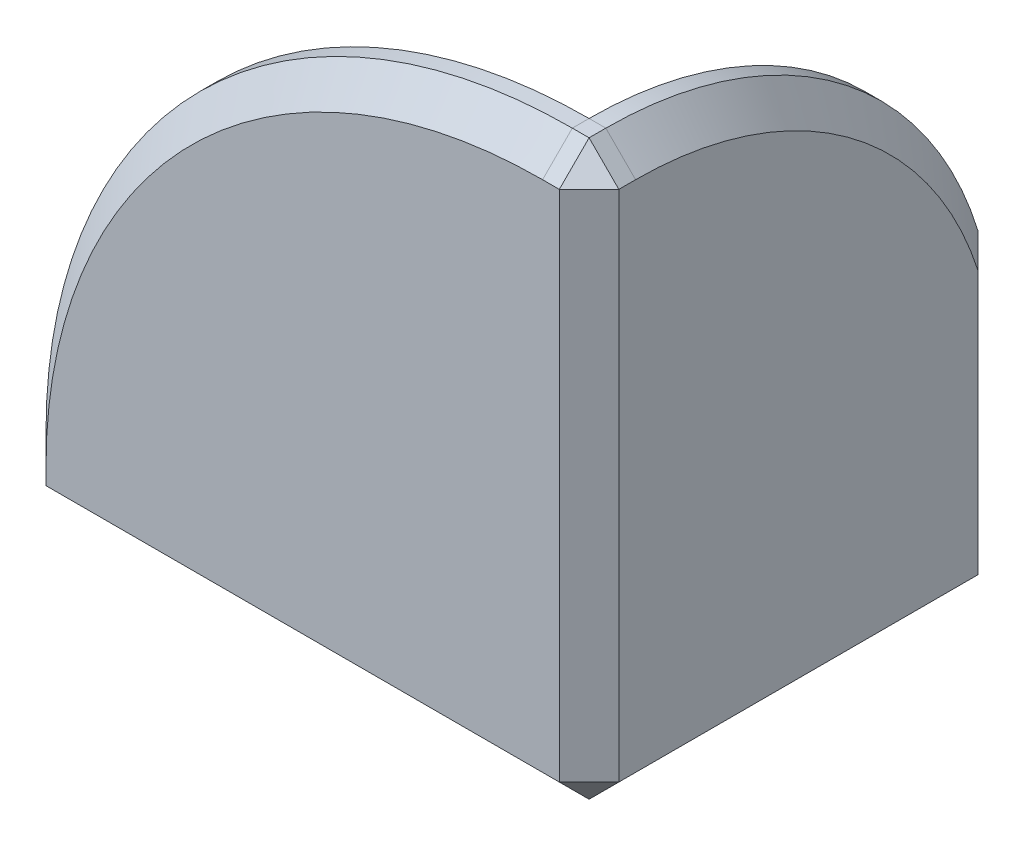
ISO-10303-21;
HEADER;
FILE_DESCRIPTION(('STEP AP214'),'2;1');
FILE_NAME('part.step','',(''),(''),'','','');
FILE_SCHEMA(('AUTOMOTIVE_DESIGN { 1 0 10303 214 1 1 1 1 }'));
ENDSEC;
DATA;
#1=APPLICATION_CONTEXT('core data for automotive mechanical design processes');
#2=APPLICATION_PROTOCOL_DEFINITION('international standard','automotive_design',2000,#1);
#3=PRODUCT_CONTEXT('',#1,'mechanical');
#4=PRODUCT('Part','Part','',(#3));
#5=PRODUCT_RELATED_PRODUCT_CATEGORY('part','',(#4));
#6=PRODUCT_DEFINITION_FORMATION('','',#4);
#7=PRODUCT_DEFINITION_CONTEXT('part definition',#1,'design');
#8=PRODUCT_DEFINITION('design','',#6,#7);
#9=PRODUCT_DEFINITION_SHAPE('','',#8);
#10=(LENGTH_UNIT() NAMED_UNIT(*) SI_UNIT(.MILLI.,.METRE.));
#11=(NAMED_UNIT(*) PLANE_ANGLE_UNIT() SI_UNIT($,.RADIAN.));
#12=(NAMED_UNIT(*) SI_UNIT($,.STERADIAN.) SOLID_ANGLE_UNIT());
#13=UNCERTAINTY_MEASURE_WITH_UNIT(LENGTH_MEASURE(1.E-05),#10,'distance_accuracy_value','');
#14=(GEOMETRIC_REPRESENTATION_CONTEXT(3) GLOBAL_UNCERTAINTY_ASSIGNED_CONTEXT((#13)) GLOBAL_UNIT_ASSIGNED_CONTEXT((#10,
#11,#12)) REPRESENTATION_CONTEXT('',''));
#15=CARTESIAN_POINT('',(0.,0.,0.));
#16=DIRECTION('',(0.,0.,1.));
#17=DIRECTION('',(1.,0.,0.));
#18=AXIS2_PLACEMENT_3D('',#15,#16,#17);
#19=CARTESIAN_POINT('',(0.,0.,3.175));
#20=DIRECTION('',(0.,0.,-1.));
#21=DIRECTION('',(-1.,0.,0.));
#22=AXIS2_PLACEMENT_3D('',#19,#20,#21);
#23=CYLINDRICAL_SURFACE('',#22,35.9210244842766);
#24=DIRECTION('',(0.,0.,-1.));
#25=VECTOR('',#24,1.);
#26=CARTESIAN_POINT('',(-35.9210244842766,0.,3.175));
#27=LINE('',#26,#25);
#28=CARTESIAN_POINT('',(-35.9210244842766,0.,1.14299999999998));
#29=VERTEX_POINT('',#28);
#30=CARTESIAN_POINT('',(-35.9210244842766,0.,0.));
#31=VERTEX_POINT('',#30);
#32=EDGE_CURVE('E182',#29,#31,#27,.T.);
#33=ORIENTED_EDGE('',*,*,#32,.F.);
#34=CARTESIAN_POINT('',(0.,0.,1.14299999999998));
#35=DIRECTION('',(0.,0.,1.));
#36=DIRECTION('',(1.,0.,0.));
#37=AXIS2_PLACEMENT_3D('',#34,#35,#36);
#38=CIRCLE('',#37,35.9210244842766);
#39=CARTESIAN_POINT('',(0.,35.9210244842766,1.14299999999998));
#40=VERTEX_POINT('',#39);
#41=EDGE_CURVE('E11',#29,#40,#38,.F.);
#42=ORIENTED_EDGE('',*,*,#41,.T.);
#43=DIRECTION('',(0.,0.,-1.));
#44=VECTOR('',#43,1.);
#45=CARTESIAN_POINT('',(0.,35.9210244842766,3.175));
#46=LINE('',#45,#44);
#47=CARTESIAN_POINT('',(0.,35.9210244842766,0.));
#48=VERTEX_POINT('',#47);
#49=EDGE_CURVE('E185',#40,#48,#46,.T.);
#50=ORIENTED_EDGE('',*,*,#49,.T.);
#51=CARTESIAN_POINT('',(0.,0.,0.));
#52=DIRECTION('',(0.,0.,1.));
#53=DIRECTION('',(1.,0.,0.));
#54=AXIS2_PLACEMENT_3D('',#51,#52,#53);
#55=CIRCLE('',#54,35.9210244842766);
#56=EDGE_CURVE('E180',#48,#31,#55,.T.);
#57=ORIENTED_EDGE('',*,*,#56,.T.);
#58=EDGE_LOOP('',(#33,#42,#50,#57));
#59=FACE_BOUND('',#58,.T.);
#60=ADVANCED_FACE('F33',(#59),#23,.T.);
#61=CARTESIAN_POINT('',(0.,0.,3.175));
#62=DIRECTION('',(0.,0.,1.));
#63=DIRECTION('',(1.,0.,0.));
#64=AXIS2_PLACEMENT_3D('',#61,#62,#63);
#65=PLANE('',#64);
#66=DIRECTION('',(0.,1.,0.));
#67=VECTOR('',#66,1.);
#68=CARTESIAN_POINT('',(1.14299999999999,35.9210244842766,3.175));
#69=LINE('',#68,#67);
#70=CARTESIAN_POINT('',(1.14299999999999,-1.14299999999999,3.175));
#71=VERTEX_POINT('',#70);
#72=CARTESIAN_POINT('',(1.14299999999999,33.8890244842766,3.175));
#73=VERTEX_POINT('',#72);
#74=EDGE_CURVE('E50',#71,#73,#69,.T.);
#75=ORIENTED_EDGE('',*,*,#74,.T.);
#76=DIRECTION('',(-1.,0.,0.));
#77=VECTOR('',#76,1.);
#78=CARTESIAN_POINT('',(0.,33.8890244842766,3.175));
#79=LINE('',#78,#77);
#80=CARTESIAN_POINT('',(0.,33.8890244842766,3.175));
#81=VERTEX_POINT('',#80);
#82=EDGE_CURVE('E42',#73,#81,#79,.T.);
#83=ORIENTED_EDGE('',*,*,#82,.T.);
#84=CARTESIAN_POINT('',(0.,0.,3.175));
#85=DIRECTION('',(0.,0.,1.));
#86=DIRECTION('',(1.,0.,0.));
#87=AXIS2_PLACEMENT_3D('',#84,#85,#86);
#88=CIRCLE('',#87,33.8890244842766);
#89=CARTESIAN_POINT('',(-33.8890244842766,0.,3.175));
#90=VERTEX_POINT('',#89);
#91=EDGE_CURVE('E236',#81,#90,#88,.T.);
#92=ORIENTED_EDGE('',*,*,#91,.T.);
#93=DIRECTION('',(0.,-1.,0.));
#94=VECTOR('',#93,1.);
#95=CARTESIAN_POINT('',(-33.8890244842766,-3.175,3.175));
#96=LINE('',#95,#94);
#97=CARTESIAN_POINT('',(-33.8890244842766,-1.14299999999999,3.175));
#98=VERTEX_POINT('',#97);
#99=EDGE_CURVE('E238',#90,#98,#96,.T.);
#100=ORIENTED_EDGE('',*,*,#99,.T.);
#101=DIRECTION('',(1.,0.,0.));
#102=VECTOR('',#101,1.);
#103=CARTESIAN_POINT('',(0.,-1.14299999999999,3.175));
#104=LINE('',#103,#102);
#105=EDGE_CURVE('E55',#98,#71,#104,.T.);
#106=ORIENTED_EDGE('',*,*,#105,.T.);
#107=EDGE_LOOP('',(#75,#83,#92,#100,#106));
#108=FACE_BOUND('',#107,.T.);
#109=ADVANCED_FACE('F359',(#108),#65,.T.);
#110=CARTESIAN_POINT('',(0.,0.,0.));
#111=DIRECTION('',(0.,0.,1.));
#112=DIRECTION('',(1.,0.,0.));
#113=AXIS2_PLACEMENT_3D('',#110,#111,#112);
#114=PLANE('',#113);
#115=DIRECTION('',(1.,0.,0.));
#116=VECTOR('',#115,1.);
#117=CARTESIAN_POINT('',(0.,0.,0.));
#118=LINE('',#117,#116);
#119=CARTESIAN_POINT('',(0.,0.,0.));
#120=VERTEX_POINT('',#119);
#121=EDGE_CURVE('E191',#31,#120,#118,.T.);
#122=ORIENTED_EDGE('',*,*,#121,.F.);
#123=ORIENTED_EDGE('',*,*,#56,.F.);
#124=DIRECTION('',(0.,1.,0.));
#125=VECTOR('',#124,1.);
#126=CARTESIAN_POINT('',(0.,0.,0.));
#127=LINE('',#126,#125);
#128=EDGE_CURVE('E183',#120,#48,#127,.T.);
#129=ORIENTED_EDGE('',*,*,#128,.F.);
#130=EDGE_LOOP('',(#122,#123,#129));
#131=FACE_BOUND('',#130,.T.);
#132=ADVANCED_FACE('F345',(#131),#114,.F.);
#133=CARTESIAN_POINT('',(3.175,0.,-25.4));
#134=DIRECTION('',(0.,0.,1.));
#135=DIRECTION('',(1.,0.,0.));
#136=AXIS2_PLACEMENT_3D('',#133,#134,#135);
#137=PLANE('',#136);
#138=DIRECTION('',(0.,-1.,0.));
#139=VECTOR('',#138,1.);
#140=CARTESIAN_POINT('',(1.14299999999998,0.,-25.4));
#141=LINE('',#140,#139);
#142=CARTESIAN_POINT('',(1.14299999999998,17.145,-25.4));
#143=VERTEX_POINT('',#142);
#144=CARTESIAN_POINT('',(1.14299999999998,-1.14299999999998,-25.4));
#145=VERTEX_POINT('',#144);
#146=EDGE_CURVE('E216',#143,#145,#141,.T.);
#147=ORIENTED_EDGE('',*,*,#146,.T.);
#148=DIRECTION('',(-1.,0.,0.));
#149=VECTOR('',#148,1.);
#150=CARTESIAN_POINT('',(-17.145,-1.14299999999998,-25.4));
#151=LINE('',#150,#149);
#152=CARTESIAN_POINT('',(-17.145,-1.14299999999998,-25.4));
#153=VERTEX_POINT('',#152);
#154=EDGE_CURVE('E147',#145,#153,#151,.T.);
#155=ORIENTED_EDGE('',*,*,#154,.T.);
#156=DIRECTION('',(0.,1.,0.));
#157=VECTOR('',#156,1.);
#158=CARTESIAN_POINT('',(-17.145,-3.175,-25.4));
#159=LINE('',#158,#157);
#160=CARTESIAN_POINT('',(-17.145,0.,-25.4));
#161=VERTEX_POINT('',#160);
#162=EDGE_CURVE('E140',#153,#161,#159,.T.);
#163=ORIENTED_EDGE('',*,*,#162,.T.);
#164=DIRECTION('',(1.,0.,0.));
#165=VECTOR('',#164,1.);
#166=CARTESIAN_POINT('',(0.,0.,-25.4));
#167=LINE('',#166,#165);
#168=CARTESIAN_POINT('',(0.,0.,-25.4));
#169=VERTEX_POINT('',#168);
#170=EDGE_CURVE('E145',#161,#169,#167,.T.);
#171=ORIENTED_EDGE('',*,*,#170,.T.);
#172=DIRECTION('',(0.,1.,0.));
#173=VECTOR('',#172,1.);
#174=CARTESIAN_POINT('',(0.,0.,-25.4));
#175=LINE('',#174,#173);
#176=CARTESIAN_POINT('',(0.,17.145,-25.4));
#177=VERTEX_POINT('',#176);
#178=EDGE_CURVE('E178',#169,#177,#175,.T.);
#179=ORIENTED_EDGE('',*,*,#178,.T.);
#180=DIRECTION('',(-1.,0.,0.));
#181=VECTOR('',#180,1.);
#182=CARTESIAN_POINT('',(3.175,17.145,-25.4));
#183=LINE('',#182,#181);
#184=EDGE_CURVE('E179',#143,#177,#183,.T.);
#185=ORIENTED_EDGE('',*,*,#184,.F.);
#186=EDGE_LOOP('',(#147,#155,#163,#171,#179,#185));
#187=FACE_BOUND('',#186,.T.);
#188=ADVANCED_FACE('F142',(#187),#137,.F.);
#189=CARTESIAN_POINT('',(3.175,9.35259152687271,0.));
#190=DIRECTION('',(-1.,0.,0.));
#191=DIRECTION('',(0.,0.,1.));
#192=AXIS2_PLACEMENT_3D('',#189,#190,#191);
#193=CYLINDRICAL_SURFACE('',#192,26.5684329574039);
#194=DIRECTION('',(-1.,0.,0.));
#195=VECTOR('',#194,1.);
#196=CARTESIAN_POINT('',(3.175,35.9210244842766,0.));
#197=LINE('',#196,#195);
#198=CARTESIAN_POINT('',(1.14299999999998,35.9210244842766,0.));
#199=VERTEX_POINT('',#198);
#200=EDGE_CURVE('E333',#199,#48,#197,.T.);
#201=ORIENTED_EDGE('',*,*,#200,.F.);
#202=CARTESIAN_POINT('',(1.14299999999998,9.35259152687271,0.));
#203=DIRECTION('',(-1.,0.,0.));
#204=DIRECTION('',(0.,0.,1.));
#205=AXIS2_PLACEMENT_3D('',#202,#203,#204);
#206=CIRCLE('',#205,26.5684329574039);
#207=EDGE_CURVE('E234',#199,#143,#206,.T.);
#208=ORIENTED_EDGE('',*,*,#207,.T.);
#209=ORIENTED_EDGE('',*,*,#184,.T.);
#210=CARTESIAN_POINT('',(0.,9.35259152687271,0.));
#211=DIRECTION('',(1.,0.,0.));
#212=DIRECTION('',(0.,0.,1.));
#213=AXIS2_PLACEMENT_3D('',#210,#211,#212);
#214=CIRCLE('',#213,26.5684329574039);
#215=EDGE_CURVE('E173',#177,#48,#214,.T.);
#216=ORIENTED_EDGE('',*,*,#215,.T.);
#217=EDGE_LOOP('',(#201,#208,#209,#216));
#218=FACE_BOUND('',#217,.T.);
#219=ADVANCED_FACE('F336',(#218),#193,.T.);
#220=CARTESIAN_POINT('',(3.175,35.9210244842766,0.));
#221=DIRECTION('',(0.,-1.,0.));
#222=DIRECTION('',(0.,0.,-1.));
#223=AXIS2_PLACEMENT_3D('',#220,#221,#222);
#224=PLANE('',#223);
#225=DIRECTION('',(1.,0.,0.));
#226=VECTOR('',#225,1.);
#227=CARTESIAN_POINT('',(3.175,35.9210244842766,1.14299999999998));
#228=LINE('',#227,#226);
#229=CARTESIAN_POINT('',(1.14299999999998,35.9210244842766,1.14299999999998));
#230=VERTEX_POINT('',#229);
#231=EDGE_CURVE('E230',#40,#230,#228,.T.);
#232=ORIENTED_EDGE('',*,*,#231,.T.);
#233=DIRECTION('',(0.,0.,-1.));
#234=VECTOR('',#233,1.);
#235=CARTESIAN_POINT('',(1.14299999999998,35.9210244842766,0.));
#236=LINE('',#235,#234);
#237=EDGE_CURVE('E232',#230,#199,#236,.T.);
#238=ORIENTED_EDGE('',*,*,#237,.T.);
#239=ORIENTED_EDGE('',*,*,#200,.T.);
#240=ORIENTED_EDGE('',*,*,#49,.F.);
#241=EDGE_LOOP('',(#232,#238,#239,#240));
#242=FACE_BOUND('',#241,.T.);
#243=ADVANCED_FACE('F331',(#242),#224,.F.);
#244=CARTESIAN_POINT('',(3.175,9.35259152687271,0.));
#245=DIRECTION('',(-1.,0.,0.));
#246=DIRECTION('',(0.,0.,1.));
#247=AXIS2_PLACEMENT_3D('',#244,#245,#246);
#248=PLANE('',#247);
#249=CARTESIAN_POINT('',(3.175,9.35259152687271,0.));
#250=DIRECTION('',(-1.,0.,0.));
#251=DIRECTION('',(0.,0.,1.));
#252=AXIS2_PLACEMENT_3D('',#249,#250,#251);
#253=CIRCLE('',#252,24.5364329574039);
#254=CARTESIAN_POINT('',(3.175,16.8341099738981,-23.368));
#255=VERTEX_POINT('',#254);
#256=CARTESIAN_POINT('',(3.175,33.8890244842766,0.));
#257=VERTEX_POINT('',#256);
#258=EDGE_CURVE('E225',#255,#257,#253,.F.);
#259=ORIENTED_EDGE('',*,*,#258,.T.);
#260=DIRECTION('',(0.,0.,1.));
#261=VECTOR('',#260,1.);
#262=CARTESIAN_POINT('',(3.175,33.8890244842766,0.));
#263=LINE('',#262,#261);
#264=CARTESIAN_POINT('',(3.175,33.8890244842766,1.14299999999998));
#265=VERTEX_POINT('',#264);
#266=EDGE_CURVE('E227',#257,#265,#263,.T.);
#267=ORIENTED_EDGE('',*,*,#266,.T.);
#268=DIRECTION('',(0.,-1.,0.));
#269=VECTOR('',#268,1.);
#270=CARTESIAN_POINT('',(3.175,-3.175,1.14299999999998));
#271=LINE('',#270,#269);
#272=CARTESIAN_POINT('',(3.175,-1.14299999999998,1.14299999999998));
#273=VERTEX_POINT('',#272);
#274=EDGE_CURVE('E219',#265,#273,#271,.T.);
#275=ORIENTED_EDGE('',*,*,#274,.T.);
#276=DIRECTION('',(0.,0.,-1.));
#277=VECTOR('',#276,1.);
#278=CARTESIAN_POINT('',(3.175,-1.14299999999998,-25.4));
#279=LINE('',#278,#277);
#280=CARTESIAN_POINT('',(3.175,-1.14299999999998,-23.368));
#281=VERTEX_POINT('',#280);
#282=EDGE_CURVE('E221',#273,#281,#279,.T.);
#283=ORIENTED_EDGE('',*,*,#282,.T.);
#284=DIRECTION('',(0.,1.,0.));
#285=VECTOR('',#284,1.);
#286=CARTESIAN_POINT('',(3.175,9.35259152687271,-23.368));
#287=LINE('',#286,#285);
#288=EDGE_CURVE('E223',#281,#255,#287,.T.);
#289=ORIENTED_EDGE('',*,*,#288,.T.);
#290=EDGE_LOOP('',(#259,#267,#275,#283,#289));
#291=FACE_BOUND('',#290,.T.);
#292=ADVANCED_FACE('F374',(#291),#248,.F.);
#293=CARTESIAN_POINT('',(0.,9.35259152687271,0.));
#294=DIRECTION('',(-1.,0.,0.));
#295=DIRECTION('',(0.,0.,1.));
#296=AXIS2_PLACEMENT_3D('',#293,#294,#295);
#297=PLANE('',#296);
#298=DIRECTION('',(0.,0.,-1.));
#299=VECTOR('',#298,1.);
#300=CARTESIAN_POINT('',(0.,0.,0.));
#301=LINE('',#300,#299);
#302=EDGE_CURVE('E165',#120,#169,#301,.T.);
#303=ORIENTED_EDGE('',*,*,#302,.F.);
#304=ORIENTED_EDGE('',*,*,#128,.T.);
#305=ORIENTED_EDGE('',*,*,#215,.F.);
#306=ORIENTED_EDGE('',*,*,#178,.F.);
#307=EDGE_LOOP('',(#303,#304,#305,#306));
#308=FACE_BOUND('',#307,.T.);
#309=ADVANCED_FACE('F341',(#308),#297,.T.);
#310=CARTESIAN_POINT('',(-9.3525915268727,0.,0.));
#311=DIRECTION('',(0.,-1.,0.));
#312=DIRECTION('',(0.,0.,-1.));
#313=AXIS2_PLACEMENT_3D('',#310,#311,#312);
#314=PLANE('',#313);
#315=CARTESIAN_POINT('',(-9.3525915268727,0.,0.));
#316=DIRECTION('',(0.,-1.,0.));
#317=DIRECTION('',(0.,0.,-1.));
#318=AXIS2_PLACEMENT_3D('',#315,#316,#317);
#319=CIRCLE('',#318,26.5684329574039);
#320=EDGE_CURVE('E155',#31,#161,#319,.T.);
#321=ORIENTED_EDGE('',*,*,#320,.F.);
#322=ORIENTED_EDGE('',*,*,#121,.T.);
#323=ORIENTED_EDGE('',*,*,#302,.T.);
#324=ORIENTED_EDGE('',*,*,#170,.F.);
#325=EDGE_LOOP('',(#321,#322,#323,#324));
#326=FACE_BOUND('',#325,.T.);
#327=ADVANCED_FACE('F163',(#326),#314,.F.);
#328=CARTESIAN_POINT('',(-35.9210244842766,-3.175,3.175));
#329=DIRECTION('',(1.,0.,0.));
#330=DIRECTION('',(0.,0.,-1.));
#331=AXIS2_PLACEMENT_3D('',#328,#329,#330);
#332=PLANE('',#331);
#333=DIRECTION('',(0.,1.,0.));
#334=VECTOR('',#333,1.);
#335=CARTESIAN_POINT('',(-35.9210244842766,-3.175,0.));
#336=LINE('',#335,#334);
#337=CARTESIAN_POINT('',(-35.9210244842766,-1.14299999999998,0.));
#338=VERTEX_POINT('',#337);
#339=EDGE_CURVE('E151',#338,#31,#336,.T.);
#340=ORIENTED_EDGE('',*,*,#339,.F.);
#341=DIRECTION('',(0.,0.,1.));
#342=VECTOR('',#341,1.);
#343=CARTESIAN_POINT('',(-35.9210244842766,-1.14299999999998,3.175));
#344=LINE('',#343,#342);
#345=CARTESIAN_POINT('',(-35.9210244842766,-1.14299999999998,1.14299999999998));
#346=VERTEX_POINT('',#345);
#347=EDGE_CURVE('E214',#338,#346,#344,.T.);
#348=ORIENTED_EDGE('',*,*,#347,.T.);
#349=DIRECTION('',(0.,1.,0.));
#350=VECTOR('',#349,1.);
#351=CARTESIAN_POINT('',(-35.9210244842766,0.,1.14299999999998));
#352=LINE('',#351,#350);
#353=EDGE_CURVE('E212',#346,#29,#352,.T.);
#354=ORIENTED_EDGE('',*,*,#353,.T.);
#355=ORIENTED_EDGE('',*,*,#32,.T.);
#356=EDGE_LOOP('',(#340,#348,#354,#355));
#357=FACE_BOUND('',#356,.T.);
#358=ADVANCED_FACE('F397',(#357),#332,.F.);
#359=CARTESIAN_POINT('',(-9.3525915268727,-3.175,0.));
#360=DIRECTION('',(0.,1.,0.));
#361=DIRECTION('',(0.,0.,1.));
#362=AXIS2_PLACEMENT_3D('',#359,#360,#361);
#363=CYLINDRICAL_SURFACE('',#362,26.5684329574039);
#364=ORIENTED_EDGE('',*,*,#162,.F.);
#365=CARTESIAN_POINT('',(-9.3525915268727,-1.14299999999998,0.));
#366=DIRECTION('',(0.,-1.,0.));
#367=DIRECTION('',(0.,0.,-1.));
#368=AXIS2_PLACEMENT_3D('',#365,#366,#367);
#369=CIRCLE('',#368,26.5684329574039);
#370=EDGE_CURVE('E210',#153,#338,#369,.F.);
#371=ORIENTED_EDGE('',*,*,#370,.T.);
#372=ORIENTED_EDGE('',*,*,#339,.T.);
#373=ORIENTED_EDGE('',*,*,#320,.T.);
#374=EDGE_LOOP('',(#364,#371,#372,#373));
#375=FACE_BOUND('',#374,.T.);
#376=ADVANCED_FACE('F156',(#375),#363,.T.);
#377=CARTESIAN_POINT('',(-9.3525915268727,-3.175,0.));
#378=DIRECTION('',(0.,-1.,0.));
#379=DIRECTION('',(0.,0.,-1.));
#380=AXIS2_PLACEMENT_3D('',#377,#378,#379);
#381=PLANE('',#380);
#382=DIRECTION('',(0.,0.,-1.));
#383=VECTOR('',#382,1.);
#384=CARTESIAN_POINT('',(-33.8890244842766,-3.175,0.));
#385=LINE('',#384,#383);
#386=CARTESIAN_POINT('',(-33.8890244842766,-3.175,1.14299999999998));
#387=VERTEX_POINT('',#386);
#388=CARTESIAN_POINT('',(-33.8890244842766,-3.175,0.));
#389=VERTEX_POINT('',#388);
#390=EDGE_CURVE('E205',#387,#389,#385,.T.);
#391=ORIENTED_EDGE('',*,*,#390,.T.);
#392=CARTESIAN_POINT('',(-9.3525915268727,-3.175,0.));
#393=DIRECTION('',(0.,-1.,0.));
#394=DIRECTION('',(0.,0.,-1.));
#395=AXIS2_PLACEMENT_3D('',#392,#393,#394);
#396=CIRCLE('',#395,24.5364329574039);
#397=CARTESIAN_POINT('',(-16.8341099738981,-3.175,-23.368));
#398=VERTEX_POINT('',#397);
#399=EDGE_CURVE('E207',#389,#398,#396,.T.);
#400=ORIENTED_EDGE('',*,*,#399,.T.);
#401=DIRECTION('',(1.,0.,0.));
#402=VECTOR('',#401,1.);
#403=CARTESIAN_POINT('',(3.175,-3.175,-23.368));
#404=LINE('',#403,#402);
#405=CARTESIAN_POINT('',(1.14299999999999,-3.175,-23.368));
#406=VERTEX_POINT('',#405);
#407=EDGE_CURVE('E203',#398,#406,#404,.T.);
#408=ORIENTED_EDGE('',*,*,#407,.T.);
#409=DIRECTION('',(0.,0.,1.));
#410=VECTOR('',#409,1.);
#411=CARTESIAN_POINT('',(1.14299999999999,-3.175,3.175));
#412=LINE('',#411,#410);
#413=CARTESIAN_POINT('',(1.14299999999999,-3.175,1.14299999999998));
#414=VERTEX_POINT('',#413);
#415=EDGE_CURVE('E201',#406,#414,#412,.T.);
#416=ORIENTED_EDGE('',*,*,#415,.T.);
#417=DIRECTION('',(-1.,0.,0.));
#418=VECTOR('',#417,1.);
#419=CARTESIAN_POINT('',(-9.3525915268727,-3.175,1.14299999999998));
#420=LINE('',#419,#418);
#421=EDGE_CURVE('E188',#414,#387,#420,.T.);
#422=ORIENTED_EDGE('',*,*,#421,.T.);
#423=EDGE_LOOP('',(#391,#400,#408,#416,#422));
#424=FACE_BOUND('',#423,.T.);
#425=ADVANCED_FACE('F403',(#424),#381,.T.);
#426=CARTESIAN_POINT('',(3.175,33.8890244842766,1.14299999999998));
#427=DIRECTION('',(0.577350269189626,0.57735026918963,0.577350269189622));
#428=DIRECTION('',(-0.70710678118655,0.707106781186545,0.));
#429=AXIS2_PLACEMENT_3D('',#426,#427,#428);
#430=PLANE('',#429);
#431=DIRECTION('',(0.70710678118655,-0.707106781186545,0.));
#432=VECTOR('',#431,1.);
#433=CARTESIAN_POINT('',(3.175,33.8890244842766,1.14299999999998));
#434=LINE('',#433,#432);
#435=EDGE_CURVE('E309',#230,#265,#434,.T.);
#436=ORIENTED_EDGE('',*,*,#435,.F.);
#437=DIRECTION('',(0.,-0.707106781186545,0.70710678118655));
#438=VECTOR('',#437,1.);
#439=CARTESIAN_POINT('',(1.14299999999999,34.9050244842766,2.15899999999999));
#440=LINE('',#439,#438);
#441=EDGE_CURVE('E37',#73,#230,#440,.F.);
#442=ORIENTED_EDGE('',*,*,#441,.F.);
#443=DIRECTION('',(0.707106781186545,0.,-0.70710678118655));
#444=VECTOR('',#443,1.);
#445=CARTESIAN_POINT('',(3.175,33.8890244842766,1.14299999999998));
#446=LINE('',#445,#444);
#447=EDGE_CURVE('E311',#265,#73,#446,.F.);
#448=ORIENTED_EDGE('',*,*,#447,.F.);
#449=EDGE_LOOP('',(#436,#442,#448));
#450=FACE_BOUND('',#449,.T.);
#451=ADVANCED_FACE('F35',(#450),#430,.T.);
#452=CARTESIAN_POINT('',(0.,33.8890244842766,3.175));
#453=DIRECTION('',(0.,0.70710678118655,0.707106781186545));
#454=DIRECTION('',(1.,0.,0.));
#455=AXIS2_PLACEMENT_3D('',#452,#453,#454);
#456=PLANE('',#455);
#457=ORIENTED_EDGE('',*,*,#441,.T.);
#458=ORIENTED_EDGE('',*,*,#231,.F.);
#459=DIRECTION('',(0.,0.707106781186545,-0.70710678118655));
#460=VECTOR('',#459,1.);
#461=CARTESIAN_POINT('',(0.,33.8890244842766,3.175));
#462=LINE('',#461,#460);
#463=EDGE_CURVE('E306',#81,#40,#462,.T.);
#464=ORIENTED_EDGE('',*,*,#463,.F.);
#465=ORIENTED_EDGE('',*,*,#82,.F.);
#466=EDGE_LOOP('',(#457,#458,#464,#465));
#467=FACE_BOUND('',#466,.T.);
#468=ADVANCED_FACE('F320',(#467),#456,.T.);
#469=CARTESIAN_POINT('',(3.175,9.35259152687271,1.14299999999998));
#470=DIRECTION('',(0.70710678118655,0.,0.707106781186545));
#471=DIRECTION('',(0.,1.,0.));
#472=AXIS2_PLACEMENT_3D('',#469,#470,#471);
#473=PLANE('',#472);
#474=ORIENTED_EDGE('',*,*,#447,.T.);
#475=ORIENTED_EDGE('',*,*,#74,.F.);
#476=DIRECTION('',(-0.707106781186545,0.,0.70710678118655));
#477=VECTOR('',#476,1.);
#478=CARTESIAN_POINT('',(2.159,-1.14299999999999,2.15899999999999));
#479=LINE('',#478,#477);
#480=EDGE_CURVE('E303',#273,#71,#479,.T.);
#481=ORIENTED_EDGE('',*,*,#480,.F.);
#482=ORIENTED_EDGE('',*,*,#274,.F.);
#483=EDGE_LOOP('',(#474,#475,#481,#482));
#484=FACE_BOUND('',#483,.T.);
#485=ADVANCED_FACE('F372',(#484),#473,.T.);
#486=CARTESIAN_POINT('',(3.175,33.8890244842766,0.));
#487=DIRECTION('',(-0.707106781186545,-0.70710678118655,0.));
#488=DIRECTION('',(0.,0.,1.));
#489=AXIS2_PLACEMENT_3D('',#486,#487,#488);
#490=PLANE('',#489);
#491=ORIENTED_EDGE('',*,*,#435,.T.);
#492=ORIENTED_EDGE('',*,*,#266,.F.);
#493=DIRECTION('',(0.70710678118655,-0.707106781186545,0.));
#494=VECTOR('',#493,1.);
#495=CARTESIAN_POINT('',(1.14299999999998,35.9210244842766,0.));
#496=LINE('',#495,#494);
#497=EDGE_CURVE('E300',#199,#257,#496,.T.);
#498=ORIENTED_EDGE('',*,*,#497,.F.);
#499=ORIENTED_EDGE('',*,*,#237,.F.);
#500=EDGE_LOOP('',(#491,#492,#498,#499));
#501=FACE_BOUND('',#500,.T.);
#502=ADVANCED_FACE('F327',(#501),#490,.F.);
#503=CARTESIAN_POINT('',(0.,0.,3.175));
#504=DIRECTION('',(0.,0.,-1.));
#505=DIRECTION('',(-1.,0.,0.));
#506=AXIS2_PLACEMENT_3D('',#503,#504,#505);
#507=CONICAL_SURFACE('',#506,33.8890244842766,0.785398163397445);
#508=ORIENTED_EDGE('',*,*,#463,.T.);
#509=ORIENTED_EDGE('',*,*,#41,.F.);
#510=DIRECTION('',(-0.707106781186545,0.,-0.70710678118655));
#511=VECTOR('',#510,1.);
#512=CARTESIAN_POINT('',(-33.8890244842766,0.,3.175));
#513=LINE('',#512,#511);
#514=EDGE_CURVE('E297',#90,#29,#513,.T.);
#515=ORIENTED_EDGE('',*,*,#514,.F.);
#516=ORIENTED_EDGE('',*,*,#91,.F.);
#517=EDGE_LOOP('',(#508,#509,#515,#516));
#518=FACE_BOUND('',#517,.T.);
#519=ADVANCED_FACE('F351',(#518),#507,.T.);
#520=CARTESIAN_POINT('',(1.14299999999999,-3.175,1.14299999999998));
#521=DIRECTION('',(0.57735026918963,-0.577350269189626,0.577350269189622));
#522=DIRECTION('',(0.707106781186545,0.70710678118655,0.));
#523=AXIS2_PLACEMENT_3D('',#520,#521,#522);
#524=PLANE('',#523);
#525=DIRECTION('',(0.707106781186545,0.70710678118655,0.));
#526=VECTOR('',#525,1.);
#527=CARTESIAN_POINT('',(1.14299999999999,-3.175,1.14299999999998));
#528=LINE('',#527,#526);
#529=EDGE_CURVE('E289',#273,#414,#528,.F.);
#530=ORIENTED_EDGE('',*,*,#529,.F.);
#531=ORIENTED_EDGE('',*,*,#480,.T.);
#532=DIRECTION('',(0.,0.707106781186545,0.70710678118655));
#533=VECTOR('',#532,1.);
#534=CARTESIAN_POINT('',(1.14299999999999,-3.175,1.14299999999998));
#535=LINE('',#534,#533);
#536=EDGE_CURVE('E294',#414,#71,#535,.T.);
#537=ORIENTED_EDGE('',*,*,#536,.F.);
#538=EDGE_LOOP('',(#530,#531,#537));
#539=FACE_BOUND('',#538,.T.);
#540=ADVANCED_FACE('F369',(#539),#524,.T.);
#541=CARTESIAN_POINT('',(3.175,9.35259152687271,0.));
#542=DIRECTION('',(-1.,0.,0.));
#543=DIRECTION('',(0.,0.,1.));
#544=AXIS2_PLACEMENT_3D('',#541,#542,#543);
#545=CONICAL_SURFACE('',#544,24.5364329574039,0.785398163397445);
#546=ORIENTED_EDGE('',*,*,#497,.T.);
#547=ORIENTED_EDGE('',*,*,#258,.F.);
#548=CARTESIAN_POINT('',(1.14299999999998,17.145,-25.4));
#549=CARTESIAN_POINT('',(1.48174638907177,17.0942273495281,-25.0612536109282));
#550=CARTESIAN_POINT('',(1.82045290896904,17.0429335233615,-24.7225470910309));
#551=CARTESIAN_POINT('',(2.4977862423099,16.939303514759,-24.0452137576901));
#552=CARTESIAN_POINT('',(2.83641305574599,16.886967332225,-23.706586944254));
#553=CARTESIAN_POINT('',(3.17500000000005,16.8341099738981,-23.3679999999999));
#554=B_SPLINE_CURVE_WITH_KNOTS('',3,(#548,#549,#550,#551,#552,#553),.UNSPECIFIED.,.F.,.F.,(4,2,
4),(0.,1.44522573620934,2.89045160852893),.UNSPECIFIED.);
#555=EDGE_CURVE('E282',#143,#255,#554,.T.);
#556=ORIENTED_EDGE('',*,*,#555,.F.);
#557=ORIENTED_EDGE('',*,*,#207,.F.);
#558=EDGE_LOOP('',(#546,#547,#556,#557));
#559=FACE_BOUND('',#558,.T.);
#560=ADVANCED_FACE('F278',(#559),#545,.T.);
#561=CARTESIAN_POINT('',(-35.9210244842766,-3.175,1.14299999999998));
#562=DIRECTION('',(-0.70710678118655,0.,0.707106781186545));
#563=DIRECTION('',(0.,-1.,0.));
#564=AXIS2_PLACEMENT_3D('',#561,#562,#563);
#565=PLANE('',#564);
#566=ORIENTED_EDGE('',*,*,#514,.T.);
#567=ORIENTED_EDGE('',*,*,#353,.F.);
#568=DIRECTION('',(-0.707106781186545,0.,-0.70710678118655));
#569=VECTOR('',#568,1.);
#570=CARTESIAN_POINT('',(-35.9210244842766,-1.14299999999998,1.14299999999998));
#571=LINE('',#570,#569);
#572=EDGE_CURVE('E290',#98,#346,#571,.T.);
#573=ORIENTED_EDGE('',*,*,#572,.F.);
#574=ORIENTED_EDGE('',*,*,#99,.F.);
#575=EDGE_LOOP('',(#566,#567,#573,#574));
#576=FACE_BOUND('',#575,.T.);
#577=ADVANCED_FACE('F355',(#576),#565,.T.);
#578=CARTESIAN_POINT('',(-9.3525915268727,-3.175,1.14299999999998));
#579=DIRECTION('',(0.,0.70710678118655,-0.707106781186545));
#580=DIRECTION('',(-1.,0.,0.));
#581=AXIS2_PLACEMENT_3D('',#578,#579,#580);
#582=PLANE('',#581);
#583=ORIENTED_EDGE('',*,*,#536,.T.);
#584=ORIENTED_EDGE('',*,*,#105,.F.);
#585=DIRECTION('',(0.,-0.707106781186545,-0.70710678118655));
#586=VECTOR('',#585,1.);
#587=CARTESIAN_POINT('',(-33.8890244842766,-2.159,2.15899999999999));
#588=LINE('',#587,#586);
#589=EDGE_CURVE('E364',#387,#98,#588,.F.);
#590=ORIENTED_EDGE('',*,*,#589,.F.);
#591=ORIENTED_EDGE('',*,*,#421,.F.);
#592=EDGE_LOOP('',(#583,#584,#590,#591));
#593=FACE_BOUND('',#592,.T.);
#594=ADVANCED_FACE('F362',(#593),#582,.F.);
#595=CARTESIAN_POINT('',(1.14299999999999,-3.175,0.));
#596=DIRECTION('',(0.70710678118655,-0.707106781186545,0.));
#597=DIRECTION('',(0.,0.,-1.));
#598=AXIS2_PLACEMENT_3D('',#595,#596,#597);
#599=PLANE('',#598);
#600=ORIENTED_EDGE('',*,*,#529,.T.);
#601=ORIENTED_EDGE('',*,*,#415,.F.);
#602=DIRECTION('',(-0.707106781186545,-0.70710678118655,0.));
#603=VECTOR('',#602,1.);
#604=CARTESIAN_POINT('',(1.14299999999999,-3.175,-23.368));
#605=LINE('',#604,#603);
#606=EDGE_CURVE('E385',#281,#406,#605,.T.);
#607=ORIENTED_EDGE('',*,*,#606,.F.);
#608=ORIENTED_EDGE('',*,*,#282,.F.);
#609=EDGE_LOOP('',(#600,#601,#607,#608));
#610=FACE_BOUND('',#609,.T.);
#611=ADVANCED_FACE('F276',(#610),#599,.T.);
#612=CARTESIAN_POINT('',(3.175,9.35259152687271,-23.368));
#613=DIRECTION('',(-0.707106781186545,0.,0.70710678118655));
#614=DIRECTION('',(0.,1.,0.));
#615=AXIS2_PLACEMENT_3D('',#612,#613,#614);
#616=PLANE('',#615);
#617=ORIENTED_EDGE('',*,*,#555,.T.);
#618=ORIENTED_EDGE('',*,*,#288,.F.);
#619=DIRECTION('',(-0.70710678118655,0.,-0.707106781186545));
#620=VECTOR('',#619,1.);
#621=CARTESIAN_POINT('',(2.15899999999999,-1.14299999999998,-24.384));
#622=LINE('',#621,#620);
#623=EDGE_CURVE('E381',#145,#281,#622,.F.);
#624=ORIENTED_EDGE('',*,*,#623,.F.);
#625=ORIENTED_EDGE('',*,*,#146,.F.);
#626=EDGE_LOOP('',(#617,#618,#624,#625));
#627=FACE_BOUND('',#626,.T.);
#628=ADVANCED_FACE('F271',(#627),#616,.F.);
#629=CARTESIAN_POINT('',(-35.9210244842766,-1.14299999999998,1.14299999999998));
#630=DIRECTION('',(-0.57735026918963,-0.577350269189626,0.577350269189622));
#631=DIRECTION('',(0.707106781186545,-0.70710678118655,0.));
#632=AXIS2_PLACEMENT_3D('',#629,#630,#631);
#633=PLANE('',#632);
#634=ORIENTED_EDGE('',*,*,#589,.T.);
#635=ORIENTED_EDGE('',*,*,#572,.T.);
#636=DIRECTION('',(0.707106781186545,-0.70710678118655,0.));
#637=VECTOR('',#636,1.);
#638=CARTESIAN_POINT('',(-35.9210244842766,-1.14299999999998,1.14299999999998));
#639=LINE('',#638,#637);
#640=EDGE_CURVE('E386',#387,#346,#639,.F.);
#641=ORIENTED_EDGE('',*,*,#640,.F.);
#642=EDGE_LOOP('',(#634,#635,#641));
#643=FACE_BOUND('',#642,.T.);
#644=ADVANCED_FACE('F267',(#643),#633,.T.);
#645=CARTESIAN_POINT('',(1.14299999999999,-3.175,-23.368));
#646=DIRECTION('',(0.577350269189626,-0.577350269189622,-0.57735026918963));
#647=DIRECTION('',(-0.70710678118655,0.,-0.707106781186545));
#648=AXIS2_PLACEMENT_3D('',#645,#646,#647);
#649=PLANE('',#648);
#650=ORIENTED_EDGE('',*,*,#623,.T.);
#651=ORIENTED_EDGE('',*,*,#606,.T.);
#652=DIRECTION('',(0.,0.70710678118655,-0.707106781186545));
#653=VECTOR('',#652,1.);
#654=CARTESIAN_POINT('',(1.14299999999999,-3.175,-23.368));
#655=LINE('',#654,#653);
#656=EDGE_CURVE('E389',#145,#406,#655,.F.);
#657=ORIENTED_EDGE('',*,*,#656,.F.);
#658=EDGE_LOOP('',(#650,#651,#657));
#659=FACE_BOUND('',#658,.T.);
#660=ADVANCED_FACE('F263',(#659),#649,.T.);
#661=CARTESIAN_POINT('',(-33.8890244842766,-3.175,0.));
#662=DIRECTION('',(-0.70710678118655,-0.707106781186545,0.));
#663=DIRECTION('',(0.,0.,1.));
#664=AXIS2_PLACEMENT_3D('',#661,#662,#663);
#665=PLANE('',#664);
#666=ORIENTED_EDGE('',*,*,#640,.T.);
#667=ORIENTED_EDGE('',*,*,#347,.F.);
#668=DIRECTION('',(-0.707106781186545,0.70710678118655,0.));
#669=VECTOR('',#668,1.);
#670=CARTESIAN_POINT('',(-33.8890244842766,-3.175,0.));
#671=LINE('',#670,#669);
#672=EDGE_CURVE('E250',#389,#338,#671,.T.);
#673=ORIENTED_EDGE('',*,*,#672,.F.);
#674=ORIENTED_EDGE('',*,*,#390,.F.);
#675=EDGE_LOOP('',(#666,#667,#673,#674));
#676=FACE_BOUND('',#675,.T.);
#677=ADVANCED_FACE('F260',(#676),#665,.T.);
#678=CARTESIAN_POINT('',(-9.3525915268727,-3.175,-23.368));
#679=DIRECTION('',(0.,-0.707106781186545,-0.70710678118655));
#680=DIRECTION('',(-1.,0.,0.));
#681=AXIS2_PLACEMENT_3D('',#678,#679,#680);
#682=PLANE('',#681);
#683=ORIENTED_EDGE('',*,*,#656,.T.);
#684=ORIENTED_EDGE('',*,*,#407,.F.);
#685=CARTESIAN_POINT('',(-16.8341099738981,-3.175,-23.3679999999999));
#686=CARTESIAN_POINT('',(-16.8869673322249,-2.83641305574596,-23.706586944254));
#687=CARTESIAN_POINT('',(-16.939303514759,-2.49778624230989,-24.0452137576901));
#688=CARTESIAN_POINT('',(-17.0429335233616,-1.82045290896905,-24.722547091031));
#689=CARTESIAN_POINT('',(-17.0942273495283,-1.48174638907179,-25.0612536109282));
#690=CARTESIAN_POINT('',(-17.1450000000004,-1.14300000000001,-25.4));
#691=B_SPLINE_CURVE_WITH_KNOTS('',3,(#685,#686,#687,#688,#689,#690),.UNSPECIFIED.,.F.,.F.,(4,2,
4),(0.,1.44522587231959,2.89045160852893),.UNSPECIFIED.);
#692=EDGE_CURVE('E243',#153,#398,#691,.F.);
#693=ORIENTED_EDGE('',*,*,#692,.F.);
#694=ORIENTED_EDGE('',*,*,#154,.F.);
#695=EDGE_LOOP('',(#683,#684,#693,#694));
#696=FACE_BOUND('',#695,.T.);
#697=ADVANCED_FACE('F252',(#696),#682,.T.);
#698=CARTESIAN_POINT('',(-9.3525915268727,-3.175,0.));
#699=DIRECTION('',(0.,1.,0.));
#700=DIRECTION('',(0.,0.,1.));
#701=AXIS2_PLACEMENT_3D('',#698,#699,#700);
#702=CONICAL_SURFACE('',#701,24.5364329574039,0.785398163397445);
#703=ORIENTED_EDGE('',*,*,#672,.T.);
#704=ORIENTED_EDGE('',*,*,#370,.F.);
#705=ORIENTED_EDGE('',*,*,#692,.T.);
#706=ORIENTED_EDGE('',*,*,#399,.F.);
#707=EDGE_LOOP('',(#703,#704,#705,#706));
#708=FACE_BOUND('',#707,.T.);
#709=ADVANCED_FACE('F255',(#708),#702,.T.);
#710=CLOSED_SHELL('',(#60,#109,#132,#188,#219,#243,#292,#309,#327,#358,#376,#425,#451,#468,#485,
#502,#519,#540,#560,#577,#594,#611,#628,#644,#660,#677,#697,#709));
#711=MANIFOLD_SOLID_BREP('B2',#710);
#712=ADVANCED_BREP_SHAPE_REPRESENTATION('',(#18,#711),#14);
#713=SHAPE_DEFINITION_REPRESENTATION(#9,#712);
ENDSEC;
END-ISO-10303-21;
